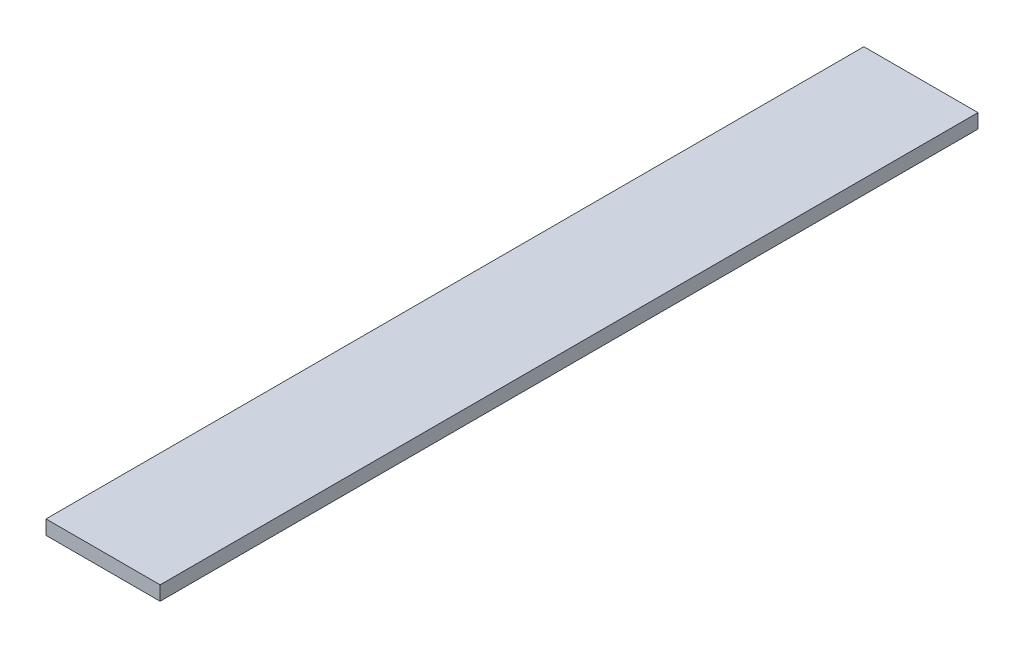
ISO-10303-21;
HEADER;
FILE_DESCRIPTION(('STEP AP214'),'2;1');
FILE_NAME('part.step','',(''),(''),'','','');
FILE_SCHEMA(('AUTOMOTIVE_DESIGN { 1 0 10303 214 1 1 1 1 }'));
ENDSEC;
DATA;
#1=APPLICATION_CONTEXT('core data for automotive mechanical design processes');
#2=APPLICATION_PROTOCOL_DEFINITION('international standard','automotive_design',2000,#1);
#3=PRODUCT_CONTEXT('',#1,'mechanical');
#4=PRODUCT('Part','Part','',(#3));
#5=PRODUCT_RELATED_PRODUCT_CATEGORY('part','',(#4));
#6=PRODUCT_DEFINITION_FORMATION('','',#4);
#7=PRODUCT_DEFINITION_CONTEXT('part definition',#1,'design');
#8=PRODUCT_DEFINITION('design','',#6,#7);
#9=PRODUCT_DEFINITION_SHAPE('','',#8);
#10=(LENGTH_UNIT() NAMED_UNIT(*) SI_UNIT(.MILLI.,.METRE.));
#11=(NAMED_UNIT(*) PLANE_ANGLE_UNIT() SI_UNIT($,.RADIAN.));
#12=(NAMED_UNIT(*) SI_UNIT($,.STERADIAN.) SOLID_ANGLE_UNIT());
#13=UNCERTAINTY_MEASURE_WITH_UNIT(LENGTH_MEASURE(1.E-05),#10,'distance_accuracy_value','');
#14=(GEOMETRIC_REPRESENTATION_CONTEXT(3) GLOBAL_UNCERTAINTY_ASSIGNED_CONTEXT((#13)) GLOBAL_UNIT_ASSIGNED_CONTEXT((#10,
#11,#12)) REPRESENTATION_CONTEXT('',''));
#15=CARTESIAN_POINT('',(0.,0.,0.));
#16=DIRECTION('',(0.,0.,1.));
#17=DIRECTION('',(1.,0.,0.));
#18=AXIS2_PLACEMENT_3D('',#15,#16,#17);
#19=CARTESIAN_POINT('',(-76.2000000000001,9.525,-546.1));
#20=DIRECTION('',(1.,0.,0.));
#21=DIRECTION('',(0.,0.,-1.));
#22=AXIS2_PLACEMENT_3D('',#19,#20,#21);
#23=PLANE('',#22);
#24=DIRECTION('',(0.,0.,1.));
#25=VECTOR('',#24,1.);
#26=CARTESIAN_POINT('',(-76.2000000000001,-9.525,-546.1));
#27=LINE('',#26,#25);
#28=CARTESIAN_POINT('',(-76.2000000000001,-9.525,-546.1));
#29=VERTEX_POINT('',#28);
#30=CARTESIAN_POINT('',(-76.2,-9.525,546.1));
#31=VERTEX_POINT('',#30);
#32=EDGE_CURVE('E95',#29,#31,#27,.T.);
#33=ORIENTED_EDGE('',*,*,#32,.T.);
#34=DIRECTION('',(0.,-1.,0.));
#35=VECTOR('',#34,1.);
#36=CARTESIAN_POINT('',(-76.2,9.525,546.1));
#37=LINE('',#36,#35);
#38=CARTESIAN_POINT('',(-76.2,9.525,546.1));
#39=VERTEX_POINT('',#38);
#40=EDGE_CURVE('E11',#39,#31,#37,.T.);
#41=ORIENTED_EDGE('',*,*,#40,.F.);
#42=DIRECTION('',(0.,0.,1.));
#43=VECTOR('',#42,1.);
#44=CARTESIAN_POINT('',(-76.2000000000001,9.525,-546.1));
#45=LINE('',#44,#43);
#46=CARTESIAN_POINT('',(-76.2000000000001,9.525,-546.1));
#47=VERTEX_POINT('',#46);
#48=EDGE_CURVE('E83',#47,#39,#45,.T.);
#49=ORIENTED_EDGE('',*,*,#48,.F.);
#50=DIRECTION('',(0.,-1.,0.));
#51=VECTOR('',#50,1.);
#52=CARTESIAN_POINT('',(-76.2000000000001,9.525,-546.1));
#53=LINE('',#52,#51);
#54=EDGE_CURVE('E91',#47,#29,#53,.T.);
#55=ORIENTED_EDGE('',*,*,#54,.T.);
#56=EDGE_LOOP('',(#33,#41,#49,#55));
#57=FACE_BOUND('',#56,.T.);
#58=ADVANCED_FACE('F32',(#57),#23,.F.);
#59=CARTESIAN_POINT('',(76.2,9.525,546.1));
#60=DIRECTION('',(0.,0.,-1.));
#61=DIRECTION('',(-1.,0.,0.));
#62=AXIS2_PLACEMENT_3D('',#59,#60,#61);
#63=PLANE('',#62);
#64=DIRECTION('',(1.,0.,0.));
#65=VECTOR('',#64,1.);
#66=CARTESIAN_POINT('',(76.2,-9.525,546.1));
#67=LINE('',#66,#65);
#68=CARTESIAN_POINT('',(76.2,-9.525,546.1));
#69=VERTEX_POINT('',#68);
#70=EDGE_CURVE('E87',#31,#69,#67,.T.);
#71=ORIENTED_EDGE('',*,*,#70,.T.);
#72=DIRECTION('',(0.,-1.,0.));
#73=VECTOR('',#72,1.);
#74=CARTESIAN_POINT('',(76.2,9.525,546.1));
#75=LINE('',#74,#73);
#76=CARTESIAN_POINT('',(76.2,9.525,546.1));
#77=VERTEX_POINT('',#76);
#78=EDGE_CURVE('E40',#77,#69,#75,.T.);
#79=ORIENTED_EDGE('',*,*,#78,.F.);
#80=DIRECTION('',(1.,0.,0.));
#81=VECTOR('',#80,1.);
#82=CARTESIAN_POINT('',(76.2,9.525,546.1));
#83=LINE('',#82,#81);
#84=EDGE_CURVE('E78',#39,#77,#83,.T.);
#85=ORIENTED_EDGE('',*,*,#84,.F.);
#86=ORIENTED_EDGE('',*,*,#40,.T.);
#87=EDGE_LOOP('',(#71,#79,#85,#86));
#88=FACE_BOUND('',#87,.T.);
#89=ADVANCED_FACE('F86',(#88),#63,.F.);
#90=CARTESIAN_POINT('',(76.1999999999999,9.525,-546.1));
#91=DIRECTION('',(-1.,0.,0.));
#92=DIRECTION('',(0.,0.,1.));
#93=AXIS2_PLACEMENT_3D('',#90,#91,#92);
#94=PLANE('',#93);
#95=DIRECTION('',(0.,0.,-1.));
#96=VECTOR('',#95,1.);
#97=CARTESIAN_POINT('',(76.1999999999999,-9.525,-546.1));
#98=LINE('',#97,#96);
#99=CARTESIAN_POINT('',(76.1999999999999,-9.525,-546.1));
#100=VERTEX_POINT('',#99);
#101=EDGE_CURVE('E65',#69,#100,#98,.T.);
#102=ORIENTED_EDGE('',*,*,#101,.T.);
#103=DIRECTION('',(0.,-1.,0.));
#104=VECTOR('',#103,1.);
#105=CARTESIAN_POINT('',(76.1999999999999,9.525,-546.1));
#106=LINE('',#105,#104);
#107=CARTESIAN_POINT('',(76.1999999999999,9.525,-546.1));
#108=VERTEX_POINT('',#107);
#109=EDGE_CURVE('E88',#108,#100,#106,.T.);
#110=ORIENTED_EDGE('',*,*,#109,.F.);
#111=DIRECTION('',(0.,0.,-1.));
#112=VECTOR('',#111,1.);
#113=CARTESIAN_POINT('',(76.1999999999999,9.525,-546.1));
#114=LINE('',#113,#112);
#115=EDGE_CURVE('E81',#77,#108,#114,.T.);
#116=ORIENTED_EDGE('',*,*,#115,.F.);
#117=ORIENTED_EDGE('',*,*,#78,.T.);
#118=EDGE_LOOP('',(#102,#110,#116,#117));
#119=FACE_BOUND('',#118,.T.);
#120=ADVANCED_FACE('F89',(#119),#94,.F.);
#121=CARTESIAN_POINT('',(76.1999999999999,9.525,-546.1));
#122=DIRECTION('',(0.,0.,1.));
#123=DIRECTION('',(1.,0.,0.));
#124=AXIS2_PLACEMENT_3D('',#121,#122,#123);
#125=PLANE('',#124);
#126=DIRECTION('',(-1.,0.,0.));
#127=VECTOR('',#126,1.);
#128=CARTESIAN_POINT('',(76.1999999999999,-9.525,-546.1));
#129=LINE('',#128,#127);
#130=EDGE_CURVE('E71',#100,#29,#129,.T.);
#131=ORIENTED_EDGE('',*,*,#130,.T.);
#132=ORIENTED_EDGE('',*,*,#54,.F.);
#133=DIRECTION('',(-1.,0.,0.));
#134=VECTOR('',#133,1.);
#135=CARTESIAN_POINT('',(76.1999999999999,9.525,-546.1));
#136=LINE('',#135,#134);
#137=EDGE_CURVE('E48',#108,#47,#136,.T.);
#138=ORIENTED_EDGE('',*,*,#137,.F.);
#139=ORIENTED_EDGE('',*,*,#109,.T.);
#140=EDGE_LOOP('',(#131,#132,#138,#139));
#141=FACE_BOUND('',#140,.T.);
#142=ADVANCED_FACE('F102',(#141),#125,.F.);
#143=CARTESIAN_POINT('',(0.,9.525,0.));
#144=DIRECTION('',(0.,-1.,0.));
#145=DIRECTION('',(0.,0.,-1.));
#146=AXIS2_PLACEMENT_3D('',#143,#144,#145);
#147=PLANE('',#146);
#148=ORIENTED_EDGE('',*,*,#48,.T.);
#149=ORIENTED_EDGE('',*,*,#84,.T.);
#150=ORIENTED_EDGE('',*,*,#115,.T.);
#151=ORIENTED_EDGE('',*,*,#137,.T.);
#152=EDGE_LOOP('',(#148,#149,#150,#151));
#153=FACE_BOUND('',#152,.T.);
#154=ADVANCED_FACE('F79',(#153),#147,.F.);
#155=CARTESIAN_POINT('',(0.,-9.525,0.));
#156=DIRECTION('',(0.,-1.,0.));
#157=DIRECTION('',(0.,0.,-1.));
#158=AXIS2_PLACEMENT_3D('',#155,#156,#157);
#159=PLANE('',#158);
#160=ORIENTED_EDGE('',*,*,#32,.F.);
#161=ORIENTED_EDGE('',*,*,#130,.F.);
#162=ORIENTED_EDGE('',*,*,#101,.F.);
#163=ORIENTED_EDGE('',*,*,#70,.F.);
#164=EDGE_LOOP('',(#160,#161,#162,#163));
#165=FACE_BOUND('',#164,.T.);
#166=ADVANCED_FACE('F105',(#165),#159,.T.);
#167=CLOSED_SHELL('',(#58,#89,#120,#142,#154,#166));
#168=MANIFOLD_SOLID_BREP('B2',#167);
#169=ADVANCED_BREP_SHAPE_REPRESENTATION('',(#18,#168),#14);
#170=SHAPE_DEFINITION_REPRESENTATION(#9,#169);
ENDSEC;
END-ISO-10303-21;
